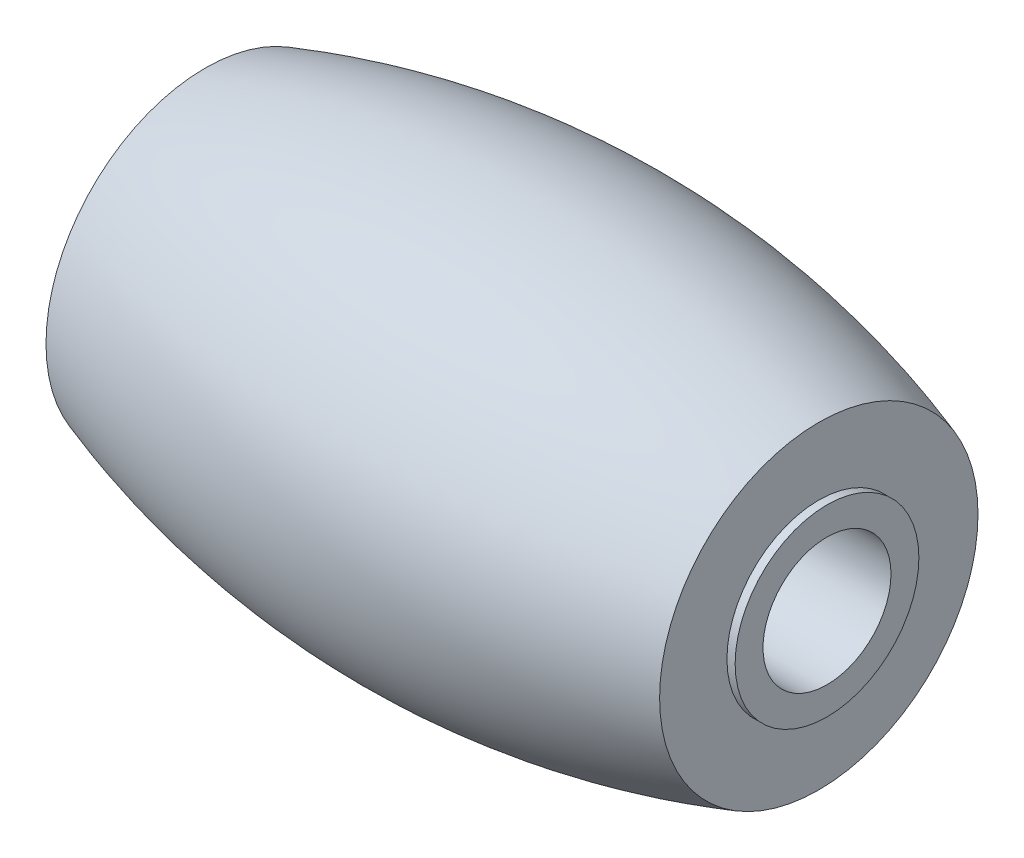
ISO-10303-21;
HEADER;
FILE_DESCRIPTION(('STEP AP214'),'2;1');
FILE_NAME('part.step','',(''),(''),'','','');
FILE_SCHEMA(('AUTOMOTIVE_DESIGN { 1 0 10303 214 1 1 1 1 }'));
ENDSEC;
DATA;
#1=APPLICATION_CONTEXT('core data for automotive mechanical design processes');
#2=APPLICATION_PROTOCOL_DEFINITION('international standard','automotive_design',2000,#1);
#3=PRODUCT_CONTEXT('',#1,'mechanical');
#4=PRODUCT('Part','Part','',(#3));
#5=PRODUCT_RELATED_PRODUCT_CATEGORY('part','',(#4));
#6=PRODUCT_DEFINITION_FORMATION('','',#4);
#7=PRODUCT_DEFINITION_CONTEXT('part definition',#1,'design');
#8=PRODUCT_DEFINITION('design','',#6,#7);
#9=PRODUCT_DEFINITION_SHAPE('','',#8);
#10=(LENGTH_UNIT() NAMED_UNIT(*) SI_UNIT(.MILLI.,.METRE.));
#11=(NAMED_UNIT(*) PLANE_ANGLE_UNIT() SI_UNIT($,.RADIAN.));
#12=(NAMED_UNIT(*) SI_UNIT($,.STERADIAN.) SOLID_ANGLE_UNIT());
#13=UNCERTAINTY_MEASURE_WITH_UNIT(LENGTH_MEASURE(1.E-05),#10,'distance_accuracy_value','');
#14=(GEOMETRIC_REPRESENTATION_CONTEXT(3) GLOBAL_UNCERTAINTY_ASSIGNED_CONTEXT((#13)) GLOBAL_UNIT_ASSIGNED_CONTEXT((#10,
#11,#12)) REPRESENTATION_CONTEXT('',''));
#15=CARTESIAN_POINT('',(0.,0.,0.));
#16=DIRECTION('',(0.,0.,1.));
#17=DIRECTION('',(1.,0.,0.));
#18=AXIS2_PLACEMENT_3D('',#15,#16,#17);
#19=CARTESIAN_POINT('',(-9.6096511220976,6.5,-17.8753234685235));
#20=CARTESIAN_POINT('',(-3.26606841682312,6.5,-15.6212993319391));
#21=CARTESIAN_POINT('',(3.46606841682505,6.5,-15.6212993319393));
#22=CARTESIAN_POINT('',(9.80965112209939,6.5,-17.8753234685241));
#23=(BOUNDED_CURVE() B_SPLINE_CURVE(3,(#19,#20,#21,#22),.UNSPECIFIED.,.F.,
.F.) B_SPLINE_CURVE_WITH_KNOTS((4,4),(0.,1.),
.UNSPECIFIED.) CURVE() GEOMETRIC_REPRESENTATION_ITEM() RATIONAL_B_SPLINE_CURVE((1.,
0.961522456838992,0.961522456838992,1.)) REPRESENTATION_ITEM(''));
#24=CARTESIAN_POINT('',(0.1,6.5,-22.60155034102));
#25=DIRECTION('',(1.,0.,0.));
#26=AXIS1_PLACEMENT('',#24,#25);
#27=SURFACE_OF_REVOLUTION('',#23,#26);
#28=CARTESIAN_POINT('',(-9.25,6.5,-22.60155034102));
#29=DIRECTION('',(1.,0.,0.));
#30=DIRECTION('',(0.,0.,-1.));
#31=AXIS2_PLACEMENT_3D('',#28,#29,#30);
#32=CIRCLE('',#31,4.85136608622606);
#33=CARTESIAN_POINT('',(-9.25,6.5,-27.4529164272461));
#34=VERTEX_POINT('',#33);
#35=EDGE_CURVE('E19',#34,#34,#32,.T.);
#36=ORIENTED_EDGE('',*,*,#35,.T.);
#37=EDGE_LOOP('',(#36));
#38=FACE_BOUND('',#37,.T.);
#39=CARTESIAN_POINT('',(9.45,6.5,-22.60155034102));
#40=DIRECTION('',(1.,0.,0.));
#41=DIRECTION('',(0.,0.,-1.));
#42=AXIS2_PLACEMENT_3D('',#39,#40,#41);
#43=CIRCLE('',#42,4.85136608622606);
#44=CARTESIAN_POINT('',(9.45,6.5,-27.4529164272461));
#45=VERTEX_POINT('',#44);
#46=EDGE_CURVE('E45',#45,#45,#43,.F.);
#47=ORIENTED_EDGE('',*,*,#46,.T.);
#48=EDGE_LOOP('',(#47));
#49=FACE_BOUND('',#48,.T.);
#50=ADVANCED_FACE('F15',(#38,#49),#27,.T.);
#51=CARTESIAN_POINT('',(-9.25,11.54542072968,-27.64697107069));
#52=DIRECTION('',(1.,0.,0.));
#53=DIRECTION('',(0.,0.,1.));
#54=AXIS2_PLACEMENT_3D('',#51,#52,#53);
#55=PLANE('',#54);
#56=CARTESIAN_POINT('',(-9.25,6.5,-22.60155034102));
#57=DIRECTION('',(1.,0.,0.));
#58=DIRECTION('',(0.,0.,-1.));
#59=AXIS2_PLACEMENT_3D('',#56,#57,#58);
#60=CIRCLE('',#59,2.8);
#61=CARTESIAN_POINT('',(-9.25,6.5,-25.40155034102));
#62=VERTEX_POINT('',#61);
#63=EDGE_CURVE('E43',#62,#62,#60,.T.);
#64=ORIENTED_EDGE('',*,*,#63,.T.);
#65=EDGE_LOOP('',(#64));
#66=FACE_BOUND('',#65,.T.);
#67=ORIENTED_EDGE('',*,*,#35,.F.);
#68=EDGE_LOOP('',(#67));
#69=FACE_BOUND('',#68,.T.);
#70=ADVANCED_FACE('F53',(#66,#69),#55,.F.);
#71=CARTESIAN_POINT('',(9.45,11.54542072968,-27.64697107069));
#72=DIRECTION('',(1.,0.,0.));
#73=DIRECTION('',(0.,0.,1.));
#74=AXIS2_PLACEMENT_3D('',#71,#72,#73);
#75=PLANE('',#74);
#76=CARTESIAN_POINT('',(9.45,6.5,-22.60155034102));
#77=DIRECTION('',(1.,0.,0.));
#78=DIRECTION('',(0.,0.,-1.));
#79=AXIS2_PLACEMENT_3D('',#76,#77,#78);
#80=CIRCLE('',#79,2.8);
#81=CARTESIAN_POINT('',(9.45,6.5,-25.40155034102));
#82=VERTEX_POINT('',#81);
#83=EDGE_CURVE('E40',#82,#82,#80,.F.);
#84=ORIENTED_EDGE('',*,*,#83,.T.);
#85=EDGE_LOOP('',(#84));
#86=FACE_BOUND('',#85,.T.);
#87=ORIENTED_EDGE('',*,*,#46,.F.);
#88=EDGE_LOOP('',(#87));
#89=FACE_BOUND('',#88,.T.);
#90=ADVANCED_FACE('F55',(#86,#89),#75,.T.);
#91=CARTESIAN_POINT('',(-9.5,6.5,-22.60155034102));
#92=DIRECTION('',(1.,0.,0.));
#93=DIRECTION('',(0.,0.,-1.));
#94=AXIS2_PLACEMENT_3D('',#91,#92,#93);
#95=CYLINDRICAL_SURFACE('',#94,2.8);
#96=ORIENTED_EDGE('',*,*,#63,.F.);
#97=EDGE_LOOP('',(#96));
#98=FACE_BOUND('',#97,.T.);
#99=CARTESIAN_POINT('',(-9.5,6.5,-22.60155034102));
#100=DIRECTION('',(1.,0.,0.));
#101=DIRECTION('',(0.,0.,-1.));
#102=AXIS2_PLACEMENT_3D('',#99,#100,#101);
#103=CIRCLE('',#102,2.8);
#104=CARTESIAN_POINT('',(-9.5,6.5,-25.40155034102));
#105=VERTEX_POINT('',#104);
#106=EDGE_CURVE('E37',#105,#105,#103,.T.);
#107=ORIENTED_EDGE('',*,*,#106,.T.);
#108=EDGE_LOOP('',(#107));
#109=FACE_BOUND('',#108,.T.);
#110=ADVANCED_FACE('F63',(#98,#109),#95,.T.);
#111=CARTESIAN_POINT('',(9.45,6.5,-22.60155034102));
#112=DIRECTION('',(1.,0.,0.));
#113=DIRECTION('',(0.,0.,-1.));
#114=AXIS2_PLACEMENT_3D('',#111,#112,#113);
#115=CYLINDRICAL_SURFACE('',#114,2.8);
#116=ORIENTED_EDGE('',*,*,#83,.F.);
#117=EDGE_LOOP('',(#116));
#118=FACE_BOUND('',#117,.T.);
#119=CARTESIAN_POINT('',(9.7,6.5,-22.60155034102));
#120=DIRECTION('',(1.,0.,0.));
#121=DIRECTION('',(0.,0.,-1.));
#122=AXIS2_PLACEMENT_3D('',#119,#120,#121);
#123=CIRCLE('',#122,2.8);
#124=CARTESIAN_POINT('',(9.7,6.5,-25.40155034102));
#125=VERTEX_POINT('',#124);
#126=EDGE_CURVE('E28',#125,#125,#123,.F.);
#127=ORIENTED_EDGE('',*,*,#126,.T.);
#128=EDGE_LOOP('',(#127));
#129=FACE_BOUND('',#128,.T.);
#130=ADVANCED_FACE('F78',(#118,#129),#115,.T.);
#131=CARTESIAN_POINT('',(-9.5,9.415623439245,-25.51355034102));
#132=DIRECTION('',(1.,0.,0.));
#133=DIRECTION('',(0.,0.,1.));
#134=AXIS2_PLACEMENT_3D('',#131,#132,#133);
#135=PLANE('',#134);
#136=CARTESIAN_POINT('',(-9.5,6.5,-22.60155034102));
#137=DIRECTION('',(1.,0.,0.));
#138=DIRECTION('',(0.,0.,-1.));
#139=AXIS2_PLACEMENT_3D('',#136,#137,#138);
#140=CIRCLE('',#139,1.95);
#141=CARTESIAN_POINT('',(-9.5,6.5,-24.55155034102));
#142=VERTEX_POINT('',#141);
#143=EDGE_CURVE('E23',#142,#142,#140,.T.);
#144=ORIENTED_EDGE('',*,*,#143,.T.);
#145=EDGE_LOOP('',(#144));
#146=FACE_BOUND('',#145,.T.);
#147=ORIENTED_EDGE('',*,*,#106,.F.);
#148=EDGE_LOOP('',(#147));
#149=FACE_BOUND('',#148,.T.);
#150=ADVANCED_FACE('F74',(#146,#149),#135,.F.);
#151=CARTESIAN_POINT('',(9.7,9.415623439245,-25.51355034102));
#152=DIRECTION('',(1.,0.,0.));
#153=DIRECTION('',(0.,0.,1.));
#154=AXIS2_PLACEMENT_3D('',#151,#152,#153);
#155=PLANE('',#154);
#156=CARTESIAN_POINT('',(9.7,6.5,-22.60155034102));
#157=DIRECTION('',(1.,0.,0.));
#158=DIRECTION('',(0.,0.,-1.));
#159=AXIS2_PLACEMENT_3D('',#156,#157,#158);
#160=CIRCLE('',#159,1.95);
#161=CARTESIAN_POINT('',(9.7,6.5,-24.55155034102));
#162=VERTEX_POINT('',#161);
#163=EDGE_CURVE('E10',#162,#162,#160,.F.);
#164=ORIENTED_EDGE('',*,*,#163,.T.);
#165=EDGE_LOOP('',(#164));
#166=FACE_BOUND('',#165,.T.);
#167=ORIENTED_EDGE('',*,*,#126,.F.);
#168=EDGE_LOOP('',(#167));
#169=FACE_BOUND('',#168,.T.);
#170=ADVANCED_FACE('F17',(#166,#169),#155,.T.);
#171=CARTESIAN_POINT('',(-9.5,6.5,-22.60155034102));
#172=DIRECTION('',(1.,0.,0.));
#173=DIRECTION('',(0.,0.,-1.));
#174=AXIS2_PLACEMENT_3D('',#171,#172,#173);
#175=CYLINDRICAL_SURFACE('',#174,1.95);
#176=ORIENTED_EDGE('',*,*,#143,.F.);
#177=EDGE_LOOP('',(#176));
#178=FACE_BOUND('',#177,.T.);
#179=ORIENTED_EDGE('',*,*,#163,.F.);
#180=EDGE_LOOP('',(#179));
#181=FACE_BOUND('',#180,.T.);
#182=ADVANCED_FACE('F67',(#178,#181),#175,.F.);
#183=CLOSED_SHELL('',(#50,#70,#90,#110,#130,#150,#170,#182));
#184=MANIFOLD_SOLID_BREP('B1',#183);
#185=ADVANCED_BREP_SHAPE_REPRESENTATION('',(#18,#184),#14);
#186=SHAPE_DEFINITION_REPRESENTATION(#9,#185);
ENDSEC;
END-ISO-10303-21;
